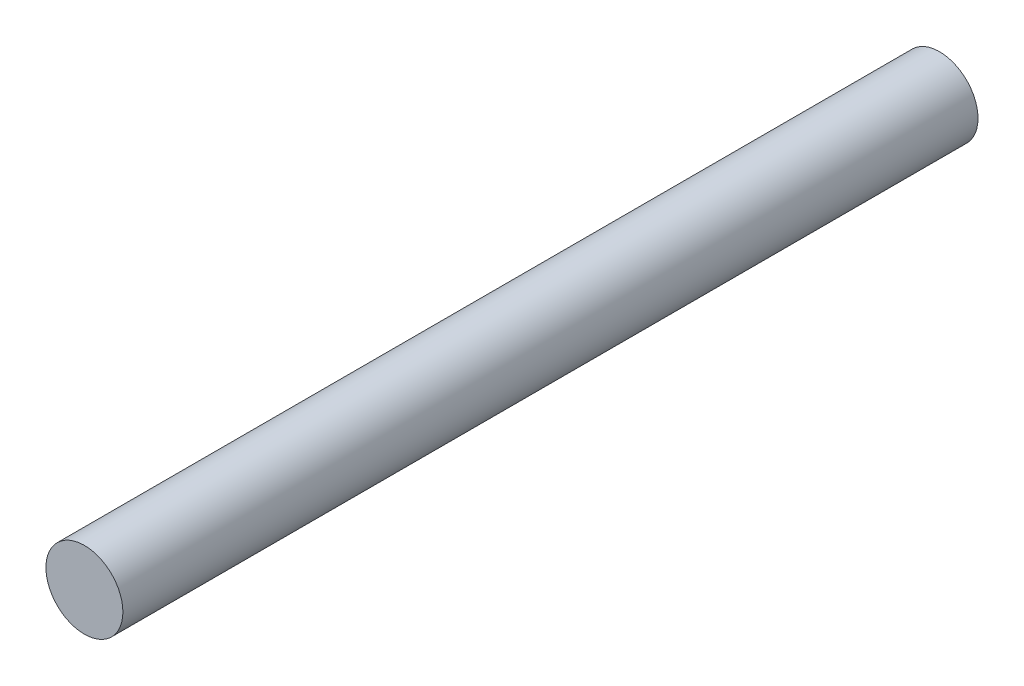
ISO-10303-21;
HEADER;
FILE_DESCRIPTION(('STEP AP214'),'2;1');
FILE_NAME('part.step','',(''),(''),'','','');
FILE_SCHEMA(('AUTOMOTIVE_DESIGN { 1 0 10303 214 1 1 1 1 }'));
ENDSEC;
DATA;
#1=APPLICATION_CONTEXT('core data for automotive mechanical design processes');
#2=APPLICATION_PROTOCOL_DEFINITION('international standard','automotive_design',2000,#1);
#3=PRODUCT_CONTEXT('',#1,'mechanical');
#4=PRODUCT('Part','Part','',(#3));
#5=PRODUCT_RELATED_PRODUCT_CATEGORY('part','',(#4));
#6=PRODUCT_DEFINITION_FORMATION('','',#4);
#7=PRODUCT_DEFINITION_CONTEXT('part definition',#1,'design');
#8=PRODUCT_DEFINITION('design','',#6,#7);
#9=PRODUCT_DEFINITION_SHAPE('','',#8);
#10=(LENGTH_UNIT() NAMED_UNIT(*) SI_UNIT(.MILLI.,.METRE.));
#11=(NAMED_UNIT(*) PLANE_ANGLE_UNIT() SI_UNIT($,.RADIAN.));
#12=(NAMED_UNIT(*) SI_UNIT($,.STERADIAN.) SOLID_ANGLE_UNIT());
#13=UNCERTAINTY_MEASURE_WITH_UNIT(LENGTH_MEASURE(1.E-05),#10,'distance_accuracy_value','');
#14=(GEOMETRIC_REPRESENTATION_CONTEXT(3) GLOBAL_UNCERTAINTY_ASSIGNED_CONTEXT((#13)) GLOBAL_UNIT_ASSIGNED_CONTEXT((#10,
#11,#12)) REPRESENTATION_CONTEXT('',''));
#15=CARTESIAN_POINT('',(0.,0.,0.));
#16=DIRECTION('',(0.,0.,1.));
#17=DIRECTION('',(1.,0.,0.));
#18=AXIS2_PLACEMENT_3D('',#15,#16,#17);
#19=CARTESIAN_POINT('',(0.,0.,60.));
#20=DIRECTION('',(0.,0.,-1.));
#21=DIRECTION('',(-1.,0.,0.));
#22=AXIS2_PLACEMENT_3D('',#19,#20,#21);
#23=CYLINDRICAL_SURFACE('',#22,2.7);
#24=CARTESIAN_POINT('',(0.,0.,60.));
#25=DIRECTION('',(0.,0.,1.));
#26=DIRECTION('',(1.,0.,0.));
#27=AXIS2_PLACEMENT_3D('',#24,#25,#26);
#28=CIRCLE('',#27,2.7);
#29=CARTESIAN_POINT('',(2.7,0.,60.));
#30=VERTEX_POINT('',#29);
#31=EDGE_CURVE('E10',#30,#30,#28,.T.);
#32=ORIENTED_EDGE('',*,*,#31,.F.);
#33=EDGE_LOOP('',(#32));
#34=FACE_BOUND('',#33,.T.);
#35=CARTESIAN_POINT('',(0.,0.,0.));
#36=DIRECTION('',(0.,0.,1.));
#37=DIRECTION('',(1.,0.,0.));
#38=AXIS2_PLACEMENT_3D('',#35,#36,#37);
#39=CIRCLE('',#38,2.7);
#40=CARTESIAN_POINT('',(2.7,0.,0.));
#41=VERTEX_POINT('',#40);
#42=EDGE_CURVE('E37',#41,#41,#39,.T.);
#43=ORIENTED_EDGE('',*,*,#42,.T.);
#44=EDGE_LOOP('',(#43));
#45=FACE_BOUND('',#44,.T.);
#46=ADVANCED_FACE('F34',(#34,#45),#23,.T.);
#47=CARTESIAN_POINT('',(0.,0.,60.));
#48=DIRECTION('',(0.,0.,1.));
#49=DIRECTION('',(1.,0.,0.));
#50=AXIS2_PLACEMENT_3D('',#47,#48,#49);
#51=PLANE('',#50);
#52=ORIENTED_EDGE('',*,*,#31,.T.);
#53=EDGE_LOOP('',(#52));
#54=FACE_BOUND('',#53,.T.);
#55=ADVANCED_FACE('F53',(#54),#51,.T.);
#56=CARTESIAN_POINT('',(0.,0.,0.));
#57=DIRECTION('',(0.,0.,1.));
#58=DIRECTION('',(1.,0.,0.));
#59=AXIS2_PLACEMENT_3D('',#56,#57,#58);
#60=PLANE('',#59);
#61=ORIENTED_EDGE('',*,*,#42,.F.);
#62=EDGE_LOOP('',(#61));
#63=FACE_BOUND('',#62,.T.);
#64=ADVANCED_FACE('F51',(#63),#60,.F.);
#65=CLOSED_SHELL('',(#46,#55,#64));
#66=MANIFOLD_SOLID_BREP('B2',#65);
#67=ADVANCED_BREP_SHAPE_REPRESENTATION('',(#18,#66),#14);
#68=SHAPE_DEFINITION_REPRESENTATION(#9,#67);
ENDSEC;
END-ISO-10303-21;
